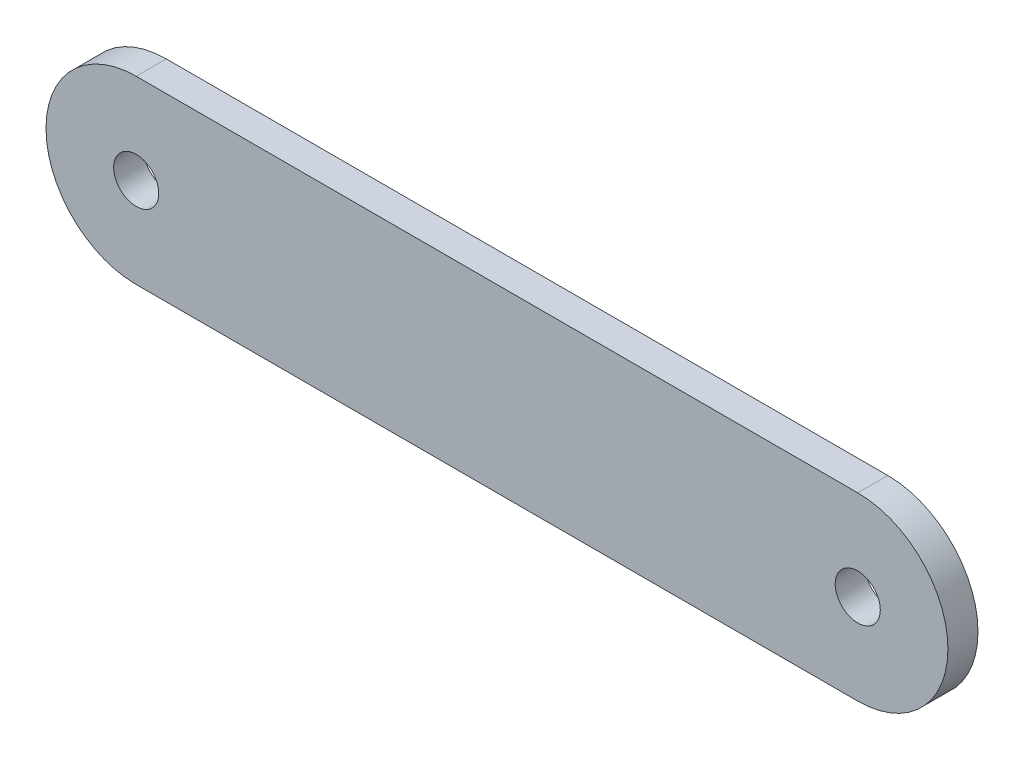
ISO-10303-21;
HEADER;
FILE_DESCRIPTION(('STEP AP214'),'2;1');
FILE_NAME('part.step','',(''),(''),'','','');
FILE_SCHEMA(('AUTOMOTIVE_DESIGN { 1 0 10303 214 1 1 1 1 }'));
ENDSEC;
DATA;
#1=APPLICATION_CONTEXT('core data for automotive mechanical design processes');
#2=APPLICATION_PROTOCOL_DEFINITION('international standard','automotive_design',2000,#1);
#3=PRODUCT_CONTEXT('',#1,'mechanical');
#4=PRODUCT('Part','Part','',(#3));
#5=PRODUCT_RELATED_PRODUCT_CATEGORY('part','',(#4));
#6=PRODUCT_DEFINITION_FORMATION('','',#4);
#7=PRODUCT_DEFINITION_CONTEXT('part definition',#1,'design');
#8=PRODUCT_DEFINITION('design','',#6,#7);
#9=PRODUCT_DEFINITION_SHAPE('','',#8);
#10=(LENGTH_UNIT() NAMED_UNIT(*) SI_UNIT(.MILLI.,.METRE.));
#11=(NAMED_UNIT(*) PLANE_ANGLE_UNIT() SI_UNIT($,.RADIAN.));
#12=(NAMED_UNIT(*) SI_UNIT($,.STERADIAN.) SOLID_ANGLE_UNIT());
#13=UNCERTAINTY_MEASURE_WITH_UNIT(LENGTH_MEASURE(1.E-05),#10,'distance_accuracy_value','');
#14=(GEOMETRIC_REPRESENTATION_CONTEXT(3) GLOBAL_UNCERTAINTY_ASSIGNED_CONTEXT((#13)) GLOBAL_UNIT_ASSIGNED_CONTEXT((#10,
#11,#12)) REPRESENTATION_CONTEXT('',''));
#15=CARTESIAN_POINT('',(0.,0.,0.));
#16=DIRECTION('',(0.,0.,1.));
#17=DIRECTION('',(1.,0.,0.));
#18=AXIS2_PLACEMENT_3D('',#15,#16,#17);
#19=CARTESIAN_POINT('',(0.,0.,6.35));
#20=DIRECTION('',(0.,0.,1.));
#21=DIRECTION('',(1.,0.,0.));
#22=AXIS2_PLACEMENT_3D('',#19,#20,#21);
#23=PLANE('',#22);
#24=CARTESIAN_POINT('',(0.,0.,6.35));
#25=DIRECTION('',(0.,0.,1.));
#26=DIRECTION('',(1.,0.,0.));
#27=AXIS2_PLACEMENT_3D('',#24,#25,#26);
#28=CIRCLE('',#27,4.7625);
#29=CARTESIAN_POINT('',(4.7625,0.,6.35));
#30=VERTEX_POINT('',#29);
#31=EDGE_CURVE('E118',#30,#30,#28,.T.);
#32=ORIENTED_EDGE('',*,*,#31,.F.);
#33=EDGE_LOOP('',(#32));
#34=FACE_BOUND('',#33,.T.);
#35=CARTESIAN_POINT('',(0.,0.,6.35));
#36=DIRECTION('',(0.,0.,1.));
#37=DIRECTION('',(1.,0.,0.));
#38=AXIS2_PLACEMENT_3D('',#35,#36,#37);
#39=CIRCLE('',#38,19.05);
#40=CARTESIAN_POINT('',(0.,19.05,6.35));
#41=VERTEX_POINT('',#40);
#42=CARTESIAN_POINT('',(0.,-19.05,6.35));
#43=VERTEX_POINT('',#42);
#44=EDGE_CURVE('E98',#41,#43,#39,.T.);
#45=ORIENTED_EDGE('',*,*,#44,.T.);
#46=DIRECTION('',(1.,0.,0.));
#47=VECTOR('',#46,1.);
#48=CARTESIAN_POINT('',(0.,-19.05,6.35));
#49=LINE('',#48,#47);
#50=CARTESIAN_POINT('',(152.4,-19.05,6.35));
#51=VERTEX_POINT('',#50);
#52=EDGE_CURVE('E93',#43,#51,#49,.T.);
#53=ORIENTED_EDGE('',*,*,#52,.T.);
#54=CARTESIAN_POINT('',(152.4,0.,6.35));
#55=DIRECTION('',(0.,0.,1.));
#56=DIRECTION('',(1.,0.,0.));
#57=AXIS2_PLACEMENT_3D('',#54,#55,#56);
#58=CIRCLE('',#57,19.05);
#59=CARTESIAN_POINT('',(152.4,19.05,6.35));
#60=VERTEX_POINT('',#59);
#61=EDGE_CURVE('E96',#51,#60,#58,.T.);
#62=ORIENTED_EDGE('',*,*,#61,.T.);
#63=DIRECTION('',(-1.,0.,0.));
#64=VECTOR('',#63,1.);
#65=CARTESIAN_POINT('',(0.,19.05,6.35));
#66=LINE('',#65,#64);
#67=EDGE_CURVE('E63',#60,#41,#66,.T.);
#68=ORIENTED_EDGE('',*,*,#67,.T.);
#69=EDGE_LOOP('',(#45,#53,#62,#68));
#70=FACE_BOUND('',#69,.T.);
#71=CARTESIAN_POINT('',(152.4,0.,6.35));
#72=DIRECTION('',(0.,0.,1.));
#73=DIRECTION('',(1.,0.,0.));
#74=AXIS2_PLACEMENT_3D('',#71,#72,#73);
#75=CIRCLE('',#74,4.76250000000001);
#76=CARTESIAN_POINT('',(157.1625,0.,6.35));
#77=VERTEX_POINT('',#76);
#78=EDGE_CURVE('E140',#77,#77,#75,.T.);
#79=ORIENTED_EDGE('',*,*,#78,.F.);
#80=EDGE_LOOP('',(#79));
#81=FACE_BOUND('',#80,.T.);
#82=ADVANCED_FACE('F45',(#34,#70,#81),#23,.T.);
#83=CARTESIAN_POINT('',(0.,0.,0.));
#84=DIRECTION('',(0.,0.,1.));
#85=DIRECTION('',(1.,0.,0.));
#86=AXIS2_PLACEMENT_3D('',#83,#84,#85);
#87=PLANE('',#86);
#88=CARTESIAN_POINT('',(0.,0.,0.));
#89=DIRECTION('',(0.,0.,1.));
#90=DIRECTION('',(1.,0.,0.));
#91=AXIS2_PLACEMENT_3D('',#88,#89,#90);
#92=CIRCLE('',#91,19.05);
#93=CARTESIAN_POINT('',(0.,19.05,0.));
#94=VERTEX_POINT('',#93);
#95=CARTESIAN_POINT('',(0.,-19.05,0.));
#96=VERTEX_POINT('',#95);
#97=EDGE_CURVE('E114',#94,#96,#92,.T.);
#98=ORIENTED_EDGE('',*,*,#97,.F.);
#99=DIRECTION('',(-1.,0.,0.));
#100=VECTOR('',#99,1.);
#101=CARTESIAN_POINT('',(0.,19.05,0.));
#102=LINE('',#101,#100);
#103=CARTESIAN_POINT('',(152.4,19.05,0.));
#104=VERTEX_POINT('',#103);
#105=EDGE_CURVE('E86',#104,#94,#102,.T.);
#106=ORIENTED_EDGE('',*,*,#105,.F.);
#107=CARTESIAN_POINT('',(152.4,0.,0.));
#108=DIRECTION('',(0.,0.,1.));
#109=DIRECTION('',(1.,0.,0.));
#110=AXIS2_PLACEMENT_3D('',#107,#108,#109);
#111=CIRCLE('',#110,19.05);
#112=CARTESIAN_POINT('',(152.4,-19.05,0.));
#113=VERTEX_POINT('',#112);
#114=EDGE_CURVE('E80',#113,#104,#111,.T.);
#115=ORIENTED_EDGE('',*,*,#114,.F.);
#116=DIRECTION('',(1.,0.,0.));
#117=VECTOR('',#116,1.);
#118=CARTESIAN_POINT('',(0.,-19.05,0.));
#119=LINE('',#118,#117);
#120=EDGE_CURVE('E103',#96,#113,#119,.T.);
#121=ORIENTED_EDGE('',*,*,#120,.F.);
#122=EDGE_LOOP('',(#98,#106,#115,#121));
#123=FACE_BOUND('',#122,.T.);
#124=CARTESIAN_POINT('',(0.,0.,0.));
#125=DIRECTION('',(0.,0.,1.));
#126=DIRECTION('',(1.,0.,0.));
#127=AXIS2_PLACEMENT_3D('',#124,#125,#126);
#128=CIRCLE('',#127,4.7625);
#129=CARTESIAN_POINT('',(4.7625,0.,0.));
#130=VERTEX_POINT('',#129);
#131=EDGE_CURVE('E136',#130,#130,#128,.T.);
#132=ORIENTED_EDGE('',*,*,#131,.T.);
#133=EDGE_LOOP('',(#132));
#134=FACE_BOUND('',#133,.T.);
#135=CARTESIAN_POINT('',(152.4,0.,0.));
#136=DIRECTION('',(0.,0.,1.));
#137=DIRECTION('',(1.,0.,0.));
#138=AXIS2_PLACEMENT_3D('',#135,#136,#137);
#139=CIRCLE('',#138,4.76250000000001);
#140=CARTESIAN_POINT('',(157.1625,0.,0.));
#141=VERTEX_POINT('',#140);
#142=EDGE_CURVE('E144',#141,#141,#139,.T.);
#143=ORIENTED_EDGE('',*,*,#142,.T.);
#144=EDGE_LOOP('',(#143));
#145=FACE_BOUND('',#144,.T.);
#146=ADVANCED_FACE('F131',(#123,#134,#145),#87,.F.);
#147=CARTESIAN_POINT('',(0.,0.,6.35));
#148=DIRECTION('',(0.,0.,-1.));
#149=DIRECTION('',(-1.,0.,0.));
#150=AXIS2_PLACEMENT_3D('',#147,#148,#149);
#151=CYLINDRICAL_SURFACE('',#150,19.05);
#152=ORIENTED_EDGE('',*,*,#97,.T.);
#153=DIRECTION('',(0.,0.,-1.));
#154=VECTOR('',#153,1.);
#155=CARTESIAN_POINT('',(0.,-19.05,6.35));
#156=LINE('',#155,#154);
#157=EDGE_CURVE('E11',#43,#96,#156,.T.);
#158=ORIENTED_EDGE('',*,*,#157,.F.);
#159=ORIENTED_EDGE('',*,*,#44,.F.);
#160=DIRECTION('',(0.,0.,-1.));
#161=VECTOR('',#160,1.);
#162=CARTESIAN_POINT('',(0.,19.05,6.35));
#163=LINE('',#162,#161);
#164=EDGE_CURVE('E110',#41,#94,#163,.T.);
#165=ORIENTED_EDGE('',*,*,#164,.T.);
#166=EDGE_LOOP('',(#152,#158,#159,#165));
#167=FACE_BOUND('',#166,.T.);
#168=ADVANCED_FACE('F47',(#167),#151,.T.);
#169=CARTESIAN_POINT('',(0.,-19.05,6.35));
#170=DIRECTION('',(0.,1.,0.));
#171=DIRECTION('',(0.,0.,1.));
#172=AXIS2_PLACEMENT_3D('',#169,#170,#171);
#173=PLANE('',#172);
#174=ORIENTED_EDGE('',*,*,#120,.T.);
#175=DIRECTION('',(0.,0.,-1.));
#176=VECTOR('',#175,1.);
#177=CARTESIAN_POINT('',(152.4,-19.05,6.35));
#178=LINE('',#177,#176);
#179=EDGE_CURVE('E55',#51,#113,#178,.T.);
#180=ORIENTED_EDGE('',*,*,#179,.F.);
#181=ORIENTED_EDGE('',*,*,#52,.F.);
#182=ORIENTED_EDGE('',*,*,#157,.T.);
#183=EDGE_LOOP('',(#174,#180,#181,#182));
#184=FACE_BOUND('',#183,.T.);
#185=ADVANCED_FACE('F102',(#184),#173,.F.);
#186=CARTESIAN_POINT('',(152.4,0.,6.35));
#187=DIRECTION('',(0.,0.,-1.));
#188=DIRECTION('',(-1.,0.,0.));
#189=AXIS2_PLACEMENT_3D('',#186,#187,#188);
#190=CYLINDRICAL_SURFACE('',#189,19.05);
#191=ORIENTED_EDGE('',*,*,#114,.T.);
#192=DIRECTION('',(0.,0.,-1.));
#193=VECTOR('',#192,1.);
#194=CARTESIAN_POINT('',(152.4,19.05,6.35));
#195=LINE('',#194,#193);
#196=EDGE_CURVE('E105',#60,#104,#195,.T.);
#197=ORIENTED_EDGE('',*,*,#196,.F.);
#198=ORIENTED_EDGE('',*,*,#61,.F.);
#199=ORIENTED_EDGE('',*,*,#179,.T.);
#200=EDGE_LOOP('',(#191,#197,#198,#199));
#201=FACE_BOUND('',#200,.T.);
#202=ADVANCED_FACE('F106',(#201),#190,.T.);
#203=CARTESIAN_POINT('',(0.,19.05,6.35));
#204=DIRECTION('',(0.,-1.,0.));
#205=DIRECTION('',(0.,0.,-1.));
#206=AXIS2_PLACEMENT_3D('',#203,#204,#205);
#207=PLANE('',#206);
#208=ORIENTED_EDGE('',*,*,#105,.T.);
#209=ORIENTED_EDGE('',*,*,#164,.F.);
#210=ORIENTED_EDGE('',*,*,#67,.F.);
#211=ORIENTED_EDGE('',*,*,#196,.T.);
#212=EDGE_LOOP('',(#208,#209,#210,#211));
#213=FACE_BOUND('',#212,.T.);
#214=ADVANCED_FACE('F128',(#213),#207,.F.);
#215=CARTESIAN_POINT('',(0.,0.,6.35));
#216=DIRECTION('',(0.,0.,-1.));
#217=DIRECTION('',(-1.,0.,0.));
#218=AXIS2_PLACEMENT_3D('',#215,#216,#217);
#219=CYLINDRICAL_SURFACE('',#218,4.7625);
#220=ORIENTED_EDGE('',*,*,#31,.T.);
#221=EDGE_LOOP('',(#220));
#222=FACE_BOUND('',#221,.T.);
#223=ORIENTED_EDGE('',*,*,#131,.F.);
#224=EDGE_LOOP('',(#223));
#225=FACE_BOUND('',#224,.T.);
#226=ADVANCED_FACE('F163',(#222,#225),#219,.F.);
#227=CARTESIAN_POINT('',(152.4,0.,6.35));
#228=DIRECTION('',(0.,0.,-1.));
#229=DIRECTION('',(-1.,0.,0.));
#230=AXIS2_PLACEMENT_3D('',#227,#228,#229);
#231=CYLINDRICAL_SURFACE('',#230,4.76250000000001);
#232=ORIENTED_EDGE('',*,*,#78,.T.);
#233=EDGE_LOOP('',(#232));
#234=FACE_BOUND('',#233,.T.);
#235=ORIENTED_EDGE('',*,*,#142,.F.);
#236=EDGE_LOOP('',(#235));
#237=FACE_BOUND('',#236,.T.);
#238=ADVANCED_FACE('F152',(#234,#237),#231,.F.);
#239=CLOSED_SHELL('',(#82,#146,#168,#185,#202,#214,#226,#238));
#240=MANIFOLD_SOLID_BREP('B2',#239);
#241=ADVANCED_BREP_SHAPE_REPRESENTATION('',(#18,#240),#14);
#242=SHAPE_DEFINITION_REPRESENTATION(#9,#241);
ENDSEC;
END-ISO-10303-21;
